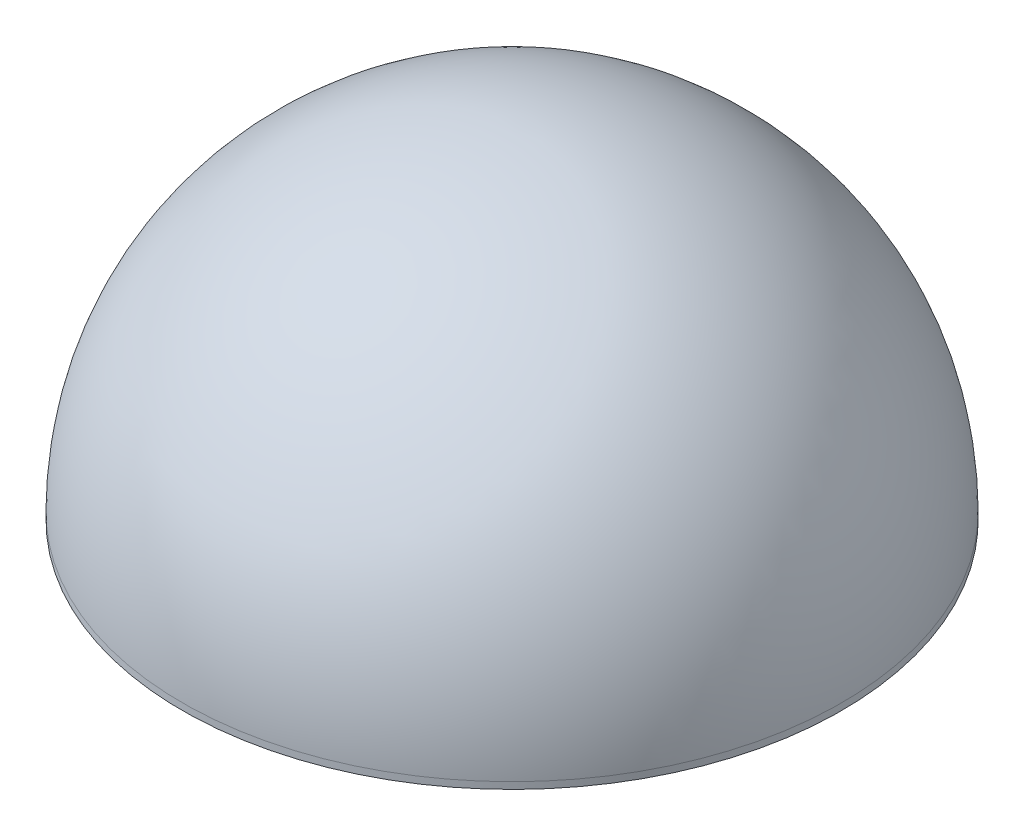
ISO-10303-21;
HEADER;
FILE_DESCRIPTION(('STEP AP214'),'2;1');
FILE_NAME('part.step','',(''),(''),'','','');
FILE_SCHEMA(('AUTOMOTIVE_DESIGN { 1 0 10303 214 1 1 1 1 }'));
ENDSEC;
DATA;
#1=APPLICATION_CONTEXT('core data for automotive mechanical design processes');
#2=APPLICATION_PROTOCOL_DEFINITION('international standard','automotive_design',2000,#1);
#3=PRODUCT_CONTEXT('',#1,'mechanical');
#4=PRODUCT('Part','Part','',(#3));
#5=PRODUCT_RELATED_PRODUCT_CATEGORY('part','',(#4));
#6=PRODUCT_DEFINITION_FORMATION('','',#4);
#7=PRODUCT_DEFINITION_CONTEXT('part definition',#1,'design');
#8=PRODUCT_DEFINITION('design','',#6,#7);
#9=PRODUCT_DEFINITION_SHAPE('','',#8);
#10=(LENGTH_UNIT() NAMED_UNIT(*) SI_UNIT(.MILLI.,.METRE.));
#11=(NAMED_UNIT(*) PLANE_ANGLE_UNIT() SI_UNIT($,.RADIAN.));
#12=(NAMED_UNIT(*) SI_UNIT($,.STERADIAN.) SOLID_ANGLE_UNIT());
#13=UNCERTAINTY_MEASURE_WITH_UNIT(LENGTH_MEASURE(1.E-05),#10,'distance_accuracy_value','');
#14=(GEOMETRIC_REPRESENTATION_CONTEXT(3) GLOBAL_UNCERTAINTY_ASSIGNED_CONTEXT((#13)) GLOBAL_UNIT_ASSIGNED_CONTEXT((#10,
#11,#12)) REPRESENTATION_CONTEXT('',''));
#15=CARTESIAN_POINT('',(0.,0.,0.));
#16=DIRECTION('',(0.,0.,1.));
#17=DIRECTION('',(1.,0.,0.));
#18=AXIS2_PLACEMENT_3D('',#15,#16,#17);
#19=CARTESIAN_POINT('',(0.,0.,0.));
#20=DIRECTION('',(0.,1.,0.));
#21=DIRECTION('',(0.,0.,1.));
#22=AXIS2_PLACEMENT_3D('',#19,#20,#21);
#23=PLANE('',#22);
#24=CARTESIAN_POINT('',(0.,0.,0.));
#25=DIRECTION('',(0.,-1.,0.));
#26=DIRECTION('',(0.,0.,-1.));
#27=AXIS2_PLACEMENT_3D('',#24,#25,#26);
#28=CIRCLE('',#27,1.5);
#29=CARTESIAN_POINT('',(0.,0.,-1.5));
#30=VERTEX_POINT('',#29);
#31=EDGE_CURVE('E43',#30,#30,#28,.T.);
#32=ORIENTED_EDGE('',*,*,#31,.F.);
#33=EDGE_LOOP('',(#32));
#34=FACE_BOUND('',#33,.T.);
#35=CARTESIAN_POINT('',(0.,0.,0.));
#36=DIRECTION('',(0.,-1.,0.));
#37=DIRECTION('',(0.,0.,-1.));
#38=AXIS2_PLACEMENT_3D('',#35,#36,#37);
#39=CIRCLE('',#38,6.22299999999999);
#40=CARTESIAN_POINT('',(0.,0.,-6.22299999999999));
#41=VERTEX_POINT('',#40);
#42=EDGE_CURVE('E10',#41,#41,#39,.T.);
#43=ORIENTED_EDGE('',*,*,#42,.T.);
#44=EDGE_LOOP('',(#43));
#45=FACE_BOUND('',#44,.T.);
#46=ADVANCED_FACE('F29',(#34,#45),#23,.F.);
#47=CARTESIAN_POINT('',(0.,0.,0.));
#48=DIRECTION('',(0.,-1.,0.));
#49=DIRECTION('',(0.,0.,-1.));
#50=AXIS2_PLACEMENT_3D('',#47,#48,#49);
#51=CYLINDRICAL_SURFACE('',#50,6.22299999999999);
#52=ORIENTED_EDGE('',*,*,#42,.F.);
#53=EDGE_LOOP('',(#52));
#54=FACE_BOUND('',#53,.T.);
#55=CARTESIAN_POINT('',(0.,0.127000000000008,0.));
#56=DIRECTION('',(0.,-1.,0.));
#57=DIRECTION('',(0.,0.,-1.));
#58=AXIS2_PLACEMENT_3D('',#55,#56,#57);
#59=CIRCLE('',#58,6.223);
#60=CARTESIAN_POINT('',(0.,0.127000000000008,-6.223));
#61=VERTEX_POINT('',#60);
#62=EDGE_CURVE('E35',#61,#61,#59,.T.);
#63=ORIENTED_EDGE('',*,*,#62,.T.);
#64=EDGE_LOOP('',(#63));
#65=FACE_BOUND('',#64,.T.);
#66=ADVANCED_FACE('F52',(#54,#65),#51,.T.);
#67=CARTESIAN_POINT('',(0.,0.127000000000008,0.));
#68=DIRECTION('',(0.,-1.,0.));
#69=DIRECTION('',(-1.,0.,0.));
#70=AXIS2_PLACEMENT_3D('',#67,#68,#69);
#71=SPHERICAL_SURFACE('',#70,6.223);
#72=ORIENTED_EDGE('',*,*,#62,.F.);
#73=EDGE_LOOP('',(#72));
#74=FACE_BOUND('',#73,.T.);
#75=ADVANCED_FACE('F56',(#74),#71,.T.);
#76=CARTESIAN_POINT('',(0.,3.175,0.));
#77=DIRECTION('',(0.,-1.,0.));
#78=DIRECTION('',(0.,0.,-1.));
#79=AXIS2_PLACEMENT_3D('',#76,#77,#78);
#80=CYLINDRICAL_SURFACE('',#79,1.5);
#81=CARTESIAN_POINT('',(0.,3.175,0.));
#82=DIRECTION('',(0.,-1.,0.));
#83=DIRECTION('',(0.,0.,-1.));
#84=AXIS2_PLACEMENT_3D('',#81,#82,#83);
#85=CIRCLE('',#84,1.5);
#86=CARTESIAN_POINT('',(0.,3.175,-1.5));
#87=VERTEX_POINT('',#86);
#88=EDGE_CURVE('E39',#87,#87,#85,.T.);
#89=ORIENTED_EDGE('',*,*,#88,.F.);
#90=EDGE_LOOP('',(#89));
#91=FACE_BOUND('',#90,.T.);
#92=ORIENTED_EDGE('',*,*,#31,.T.);
#93=EDGE_LOOP('',(#92));
#94=FACE_BOUND('',#93,.T.);
#95=ADVANCED_FACE('F49',(#91,#94),#80,.F.);
#96=CARTESIAN_POINT('',(0.,3.175,0.));
#97=DIRECTION('',(0.,-1.,0.));
#98=DIRECTION('',(0.,0.,-1.));
#99=AXIS2_PLACEMENT_3D('',#96,#97,#98);
#100=PLANE('',#99);
#101=ORIENTED_EDGE('',*,*,#88,.T.);
#102=EDGE_LOOP('',(#101));
#103=FACE_BOUND('',#102,.T.);
#104=ADVANCED_FACE('F66',(#103),#100,.T.);
#105=CLOSED_SHELL('',(#46,#66,#75,#95,#104));
#106=MANIFOLD_SOLID_BREP('B2',#105);
#107=ADVANCED_BREP_SHAPE_REPRESENTATION('',(#18,#106),#14);
#108=SHAPE_DEFINITION_REPRESENTATION(#9,#107);
ENDSEC;
END-ISO-10303-21;
